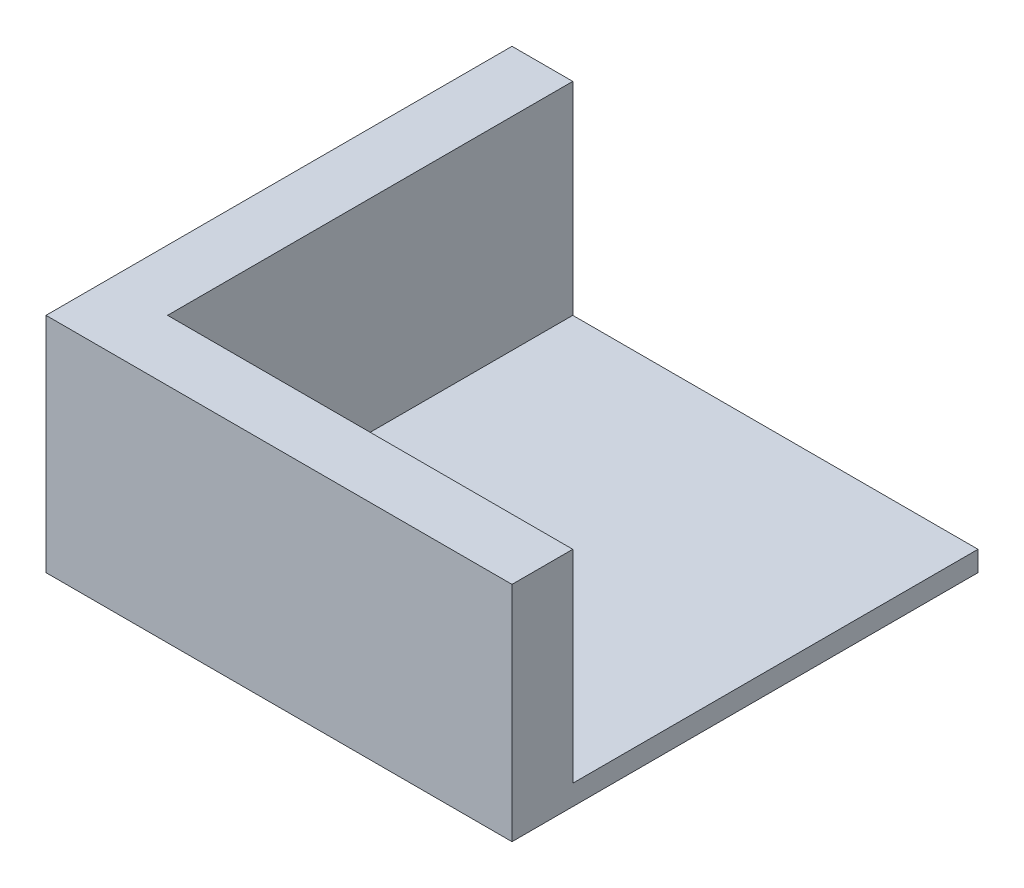
ISO-10303-21;
HEADER;
FILE_DESCRIPTION(('STEP AP214'),'2;1');
FILE_NAME('part.step','',(''),(''),'','','');
FILE_SCHEMA(('AUTOMOTIVE_DESIGN { 1 0 10303 214 1 1 1 1 }'));
ENDSEC;
DATA;
#1=APPLICATION_CONTEXT('core data for automotive mechanical design processes');
#2=APPLICATION_PROTOCOL_DEFINITION('international standard','automotive_design',2000,#1);
#3=PRODUCT_CONTEXT('',#1,'mechanical');
#4=PRODUCT('Part','Part','',(#3));
#5=PRODUCT_RELATED_PRODUCT_CATEGORY('part','',(#4));
#6=PRODUCT_DEFINITION_FORMATION('','',#4);
#7=PRODUCT_DEFINITION_CONTEXT('part definition',#1,'design');
#8=PRODUCT_DEFINITION('design','',#6,#7);
#9=PRODUCT_DEFINITION_SHAPE('','',#8);
#10=(LENGTH_UNIT() NAMED_UNIT(*) SI_UNIT(.MILLI.,.METRE.));
#11=(NAMED_UNIT(*) PLANE_ANGLE_UNIT() SI_UNIT($,.RADIAN.));
#12=(NAMED_UNIT(*) SI_UNIT($,.STERADIAN.) SOLID_ANGLE_UNIT());
#13=UNCERTAINTY_MEASURE_WITH_UNIT(LENGTH_MEASURE(1.E-05),#10,'distance_accuracy_value','');
#14=(GEOMETRIC_REPRESENTATION_CONTEXT(3) GLOBAL_UNCERTAINTY_ASSIGNED_CONTEXT((#13)) GLOBAL_UNIT_ASSIGNED_CONTEXT((#10,
#11,#12)) REPRESENTATION_CONTEXT('',''));
#15=CARTESIAN_POINT('',(0.,0.,0.));
#16=DIRECTION('',(0.,0.,1.));
#17=DIRECTION('',(1.,0.,0.));
#18=AXIS2_PLACEMENT_3D('',#15,#16,#17);
#19=CARTESIAN_POINT('',(-36.4898729141216,10.,-17.7501176470588));
#20=DIRECTION('',(1.,0.,0.));
#21=DIRECTION('',(0.,0.,-1.));
#22=AXIS2_PLACEMENT_3D('',#19,#20,#21);
#23=PLANE('',#22);
#24=DIRECTION('',(0.,-1.,0.));
#25=VECTOR('',#24,1.);
#26=CARTESIAN_POINT('',(-36.4898729141216,10.,-20.7501176470588));
#27=LINE('',#26,#25);
#28=CARTESIAN_POINT('',(-36.4898729141216,10.,-20.7501176470588));
#29=VERTEX_POINT('',#28);
#30=CARTESIAN_POINT('',(-36.4898729141216,-1.,-20.7501176470588));
#31=VERTEX_POINT('',#30);
#32=EDGE_CURVE('E92',#29,#31,#27,.T.);
#33=ORIENTED_EDGE('',*,*,#32,.T.);
#34=DIRECTION('',(0.,0.,-1.));
#35=VECTOR('',#34,1.);
#36=CARTESIAN_POINT('',(-36.4898729141216,-1.,2.24988235294117));
#37=LINE('',#36,#35);
#38=CARTESIAN_POINT('',(-36.4898729141216,-1.,2.24988235294117));
#39=VERTEX_POINT('',#38);
#40=EDGE_CURVE('E96',#39,#31,#37,.T.);
#41=ORIENTED_EDGE('',*,*,#40,.F.);
#42=DIRECTION('',(0.,-1.,0.));
#43=VECTOR('',#42,1.);
#44=CARTESIAN_POINT('',(-36.4898729141216,10.,2.24988235294117));
#45=LINE('',#44,#43);
#46=CARTESIAN_POINT('',(-36.4898729141216,10.,2.24988235294117));
#47=VERTEX_POINT('',#46);
#48=EDGE_CURVE('E11',#47,#39,#45,.T.);
#49=ORIENTED_EDGE('',*,*,#48,.F.);
#50=DIRECTION('',(0.,0.,1.));
#51=VECTOR('',#50,1.);
#52=CARTESIAN_POINT('',(-36.4898729141216,10.,-20.7501176470588));
#53=LINE('',#52,#51);
#54=EDGE_CURVE('E97',#29,#47,#53,.T.);
#55=ORIENTED_EDGE('',*,*,#54,.F.);
#56=EDGE_LOOP('',(#33,#41,#49,#55));
#57=FACE_BOUND('',#56,.T.);
#58=ADVANCED_FACE('F39',(#57),#23,.F.);
#59=CARTESIAN_POINT('',(-36.4898729141216,10.,2.24988235294117));
#60=DIRECTION('',(0.,0.,-1.));
#61=DIRECTION('',(-1.,0.,0.));
#62=AXIS2_PLACEMENT_3D('',#59,#60,#61);
#63=PLANE('',#62);
#64=ORIENTED_EDGE('',*,*,#48,.T.);
#65=DIRECTION('',(-1.,0.,0.));
#66=VECTOR('',#65,1.);
#67=CARTESIAN_POINT('',(-36.4898729141216,-1.,2.24988235294117));
#68=LINE('',#67,#66);
#69=CARTESIAN_POINT('',(-13.4898729141216,-1.,2.24988235294117));
#70=VERTEX_POINT('',#69);
#71=EDGE_CURVE('E117',#70,#39,#68,.T.);
#72=ORIENTED_EDGE('',*,*,#71,.F.);
#73=DIRECTION('',(0.,-1.,0.));
#74=VECTOR('',#73,1.);
#75=CARTESIAN_POINT('',(-13.4898729141216,10.,2.24988235294117));
#76=LINE('',#75,#74);
#77=CARTESIAN_POINT('',(-13.4898729141216,10.,2.24988235294117));
#78=VERTEX_POINT('',#77);
#79=EDGE_CURVE('E48',#78,#70,#76,.T.);
#80=ORIENTED_EDGE('',*,*,#79,.F.);
#81=DIRECTION('',(1.,0.,0.));
#82=VECTOR('',#81,1.);
#83=CARTESIAN_POINT('',(-36.4898729141216,10.,2.24988235294117));
#84=LINE('',#83,#82);
#85=EDGE_CURVE('E137',#47,#78,#84,.T.);
#86=ORIENTED_EDGE('',*,*,#85,.F.);
#87=EDGE_LOOP('',(#64,#72,#80,#86));
#88=FACE_BOUND('',#87,.T.);
#89=ADVANCED_FACE('F175',(#88),#63,.F.);
#90=CARTESIAN_POINT('',(-13.4898729141216,10.,2.24988235294117));
#91=DIRECTION('',(-1.,0.,0.));
#92=DIRECTION('',(0.,0.,1.));
#93=AXIS2_PLACEMENT_3D('',#90,#91,#92);
#94=PLANE('',#93);
#95=ORIENTED_EDGE('',*,*,#79,.T.);
#96=DIRECTION('',(0.,0.,1.));
#97=VECTOR('',#96,1.);
#98=CARTESIAN_POINT('',(-13.4898729141216,-1.,2.24988235294117));
#99=LINE('',#98,#97);
#100=CARTESIAN_POINT('',(-13.4898729141216,-1.,-20.7501176470588));
#101=VERTEX_POINT('',#100);
#102=EDGE_CURVE('E112',#101,#70,#99,.T.);
#103=ORIENTED_EDGE('',*,*,#102,.F.);
#104=DIRECTION('',(0.,1.,0.));
#105=VECTOR('',#104,1.);
#106=CARTESIAN_POINT('',(-13.4898729141216,-1.,-20.7501176470588));
#107=LINE('',#106,#105);
#108=CARTESIAN_POINT('',(-13.4898729141216,0.,-20.7501176470588));
#109=VERTEX_POINT('',#108);
#110=EDGE_CURVE('E107',#101,#109,#107,.T.);
#111=ORIENTED_EDGE('',*,*,#110,.T.);
#112=DIRECTION('',(0.,0.,1.));
#113=VECTOR('',#112,1.);
#114=CARTESIAN_POINT('',(-13.4898729141216,0.,2.24988235294117));
#115=LINE('',#114,#113);
#116=CARTESIAN_POINT('',(-13.4898729141216,0.,-0.750117647058833));
#117=VERTEX_POINT('',#116);
#118=EDGE_CURVE('E119',#109,#117,#115,.T.);
#119=ORIENTED_EDGE('',*,*,#118,.T.);
#120=DIRECTION('',(0.,-1.,0.));
#121=VECTOR('',#120,1.);
#122=CARTESIAN_POINT('',(-13.4898729141216,10.,-0.750117647058833));
#123=LINE('',#122,#121);
#124=CARTESIAN_POINT('',(-13.4898729141216,10.,-0.750117647058833));
#125=VERTEX_POINT('',#124);
#126=EDGE_CURVE('E164',#125,#117,#123,.T.);
#127=ORIENTED_EDGE('',*,*,#126,.F.);
#128=DIRECTION('',(0.,0.,-1.));
#129=VECTOR('',#128,1.);
#130=CARTESIAN_POINT('',(-13.4898729141216,10.,2.24988235294117));
#131=LINE('',#130,#129);
#132=EDGE_CURVE('E141',#78,#125,#131,.T.);
#133=ORIENTED_EDGE('',*,*,#132,.F.);
#134=EDGE_LOOP('',(#95,#103,#111,#119,#127,#133));
#135=FACE_BOUND('',#134,.T.);
#136=ADVANCED_FACE('F171',(#135),#94,.F.);
#137=CARTESIAN_POINT('',(-13.4898729141216,10.,-0.750117647058833));
#138=DIRECTION('',(0.,0.,1.));
#139=DIRECTION('',(1.,0.,0.));
#140=AXIS2_PLACEMENT_3D('',#137,#138,#139);
#141=PLANE('',#140);
#142=DIRECTION('',(-1.,0.,0.));
#143=VECTOR('',#142,1.);
#144=CARTESIAN_POINT('',(-13.4898729141216,0.,-0.750117647058833));
#145=LINE('',#144,#143);
#146=CARTESIAN_POINT('',(-33.4898729141216,0.,-0.750117647058833));
#147=VERTEX_POINT('',#146);
#148=EDGE_CURVE('E134',#117,#147,#145,.T.);
#149=ORIENTED_EDGE('',*,*,#148,.T.);
#150=DIRECTION('',(0.,-1.,0.));
#151=VECTOR('',#150,1.);
#152=CARTESIAN_POINT('',(-33.4898729141216,10.,-0.750117647058833));
#153=LINE('',#152,#151);
#154=CARTESIAN_POINT('',(-33.4898729141216,10.,-0.750117647058833));
#155=VERTEX_POINT('',#154);
#156=EDGE_CURVE('E160',#155,#147,#153,.T.);
#157=ORIENTED_EDGE('',*,*,#156,.F.);
#158=DIRECTION('',(-1.,0.,0.));
#159=VECTOR('',#158,1.);
#160=CARTESIAN_POINT('',(-13.4898729141216,10.,-0.750117647058833));
#161=LINE('',#160,#159);
#162=EDGE_CURVE('E144',#125,#155,#161,.T.);
#163=ORIENTED_EDGE('',*,*,#162,.F.);
#164=ORIENTED_EDGE('',*,*,#126,.T.);
#165=EDGE_LOOP('',(#149,#157,#163,#164));
#166=FACE_BOUND('',#165,.T.);
#167=ADVANCED_FACE('F181',(#166),#141,.F.);
#168=CARTESIAN_POINT('',(-33.4898729141216,10.,-0.750117647058833));
#169=DIRECTION('',(-1.,0.,0.));
#170=DIRECTION('',(0.,0.,1.));
#171=AXIS2_PLACEMENT_3D('',#168,#169,#170);
#172=PLANE('',#171);
#173=DIRECTION('',(0.,0.,-1.));
#174=VECTOR('',#173,1.);
#175=CARTESIAN_POINT('',(-33.4898729141216,0.,-0.750117647058833));
#176=LINE('',#175,#174);
#177=CARTESIAN_POINT('',(-33.4898729141216,0.,-20.7501176470588));
#178=VERTEX_POINT('',#177);
#179=EDGE_CURVE('E138',#147,#178,#176,.T.);
#180=ORIENTED_EDGE('',*,*,#179,.T.);
#181=DIRECTION('',(0.,-1.,0.));
#182=VECTOR('',#181,1.);
#183=CARTESIAN_POINT('',(-33.4898729141216,10.,-20.7501176470588));
#184=LINE('',#183,#182);
#185=CARTESIAN_POINT('',(-33.4898729141216,10.,-20.7501176470588));
#186=VERTEX_POINT('',#185);
#187=EDGE_CURVE('E100',#186,#178,#184,.T.);
#188=ORIENTED_EDGE('',*,*,#187,.F.);
#189=DIRECTION('',(0.,0.,-1.));
#190=VECTOR('',#189,1.);
#191=CARTESIAN_POINT('',(-33.4898729141216,10.,-0.750117647058833));
#192=LINE('',#191,#190);
#193=EDGE_CURVE('E147',#155,#186,#192,.T.);
#194=ORIENTED_EDGE('',*,*,#193,.F.);
#195=ORIENTED_EDGE('',*,*,#156,.T.);
#196=EDGE_LOOP('',(#180,#188,#194,#195));
#197=FACE_BOUND('',#196,.T.);
#198=ADVANCED_FACE('F185',(#197),#172,.F.);
#199=CARTESIAN_POINT('',(-33.4898729141216,10.,-20.7501176470588));
#200=DIRECTION('',(0.,0.,1.));
#201=DIRECTION('',(1.,0.,0.));
#202=AXIS2_PLACEMENT_3D('',#199,#200,#201);
#203=PLANE('',#202);
#204=ORIENTED_EDGE('',*,*,#187,.T.);
#205=DIRECTION('',(1.,0.,0.));
#206=VECTOR('',#205,1.);
#207=CARTESIAN_POINT('',(-36.4898729141216,0.,-20.7501176470588));
#208=LINE('',#207,#206);
#209=EDGE_CURVE('E123',#178,#109,#208,.T.);
#210=ORIENTED_EDGE('',*,*,#209,.T.);
#211=ORIENTED_EDGE('',*,*,#110,.F.);
#212=DIRECTION('',(1.,0.,0.));
#213=VECTOR('',#212,1.);
#214=CARTESIAN_POINT('',(-36.4898729141216,-1.,-20.7501176470588));
#215=LINE('',#214,#213);
#216=EDGE_CURVE('E103',#31,#101,#215,.T.);
#217=ORIENTED_EDGE('',*,*,#216,.F.);
#218=ORIENTED_EDGE('',*,*,#32,.F.);
#219=DIRECTION('',(-1.,0.,0.));
#220=VECTOR('',#219,1.);
#221=CARTESIAN_POINT('',(-33.4898729141216,10.,-20.7501176470588));
#222=LINE('',#221,#220);
#223=EDGE_CURVE('E55',#186,#29,#222,.T.);
#224=ORIENTED_EDGE('',*,*,#223,.F.);
#225=EDGE_LOOP('',(#204,#210,#211,#217,#218,#224));
#226=FACE_BOUND('',#225,.T.);
#227=ADVANCED_FACE('F105',(#226),#203,.F.);
#228=CARTESIAN_POINT('',(0.,10.,0.));
#229=DIRECTION('',(0.,1.,0.));
#230=DIRECTION('',(0.,0.,1.));
#231=AXIS2_PLACEMENT_3D('',#228,#229,#230);
#232=PLANE('',#231);
#233=ORIENTED_EDGE('',*,*,#54,.T.);
#234=ORIENTED_EDGE('',*,*,#85,.T.);
#235=ORIENTED_EDGE('',*,*,#132,.T.);
#236=ORIENTED_EDGE('',*,*,#162,.T.);
#237=ORIENTED_EDGE('',*,*,#193,.T.);
#238=ORIENTED_EDGE('',*,*,#223,.T.);
#239=EDGE_LOOP('',(#233,#234,#235,#236,#237,#238));
#240=FACE_BOUND('',#239,.T.);
#241=ADVANCED_FACE('F176',(#240),#232,.T.);
#242=CARTESIAN_POINT('',(0.,-1.,0.));
#243=DIRECTION('',(0.,-1.,0.));
#244=DIRECTION('',(0.,0.,-1.));
#245=AXIS2_PLACEMENT_3D('',#242,#243,#244);
#246=PLANE('',#245);
#247=ORIENTED_EDGE('',*,*,#40,.T.);
#248=ORIENTED_EDGE('',*,*,#216,.T.);
#249=ORIENTED_EDGE('',*,*,#102,.T.);
#250=ORIENTED_EDGE('',*,*,#71,.T.);
#251=EDGE_LOOP('',(#247,#248,#249,#250));
#252=FACE_BOUND('',#251,.T.);
#253=ADVANCED_FACE('F115',(#252),#246,.T.);
#254=CARTESIAN_POINT('',(0.,0.,0.));
#255=DIRECTION('',(0.,-1.,0.));
#256=DIRECTION('',(0.,0.,-1.));
#257=AXIS2_PLACEMENT_3D('',#254,#255,#256);
#258=PLANE('',#257);
#259=ORIENTED_EDGE('',*,*,#179,.F.);
#260=ORIENTED_EDGE('',*,*,#148,.F.);
#261=ORIENTED_EDGE('',*,*,#118,.F.);
#262=ORIENTED_EDGE('',*,*,#209,.F.);
#263=EDGE_LOOP('',(#259,#260,#261,#262));
#264=FACE_BOUND('',#263,.T.);
#265=ADVANCED_FACE('F188',(#264),#258,.F.);
#266=CLOSED_SHELL('',(#58,#89,#136,#167,#198,#227,#241,#253,#265));
#267=MANIFOLD_SOLID_BREP('B2',#266);
#268=ADVANCED_BREP_SHAPE_REPRESENTATION('',(#18,#267),#14);
#269=SHAPE_DEFINITION_REPRESENTATION(#9,#268);
ENDSEC;
END-ISO-10303-21;
